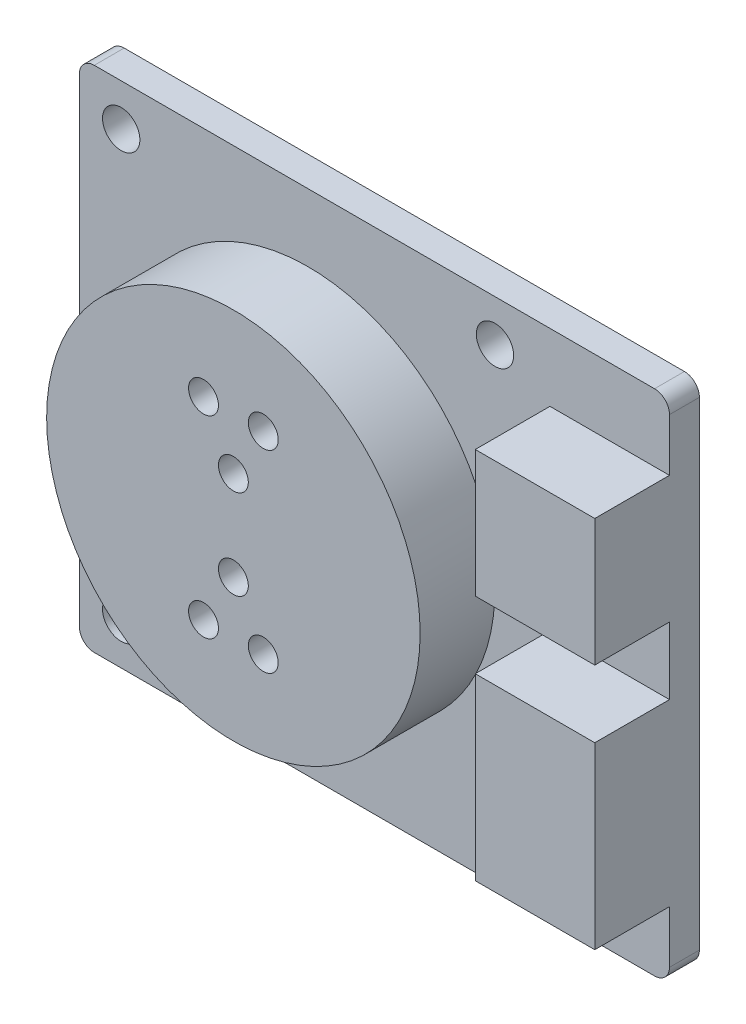
ISO-10303-21;
HEADER;
FILE_DESCRIPTION(('STEP AP214'),'2;1');
FILE_NAME('part.step','',(''),(''),'','','');
FILE_SCHEMA(('AUTOMOTIVE_DESIGN { 1 0 10303 214 1 1 1 1 }'));
ENDSEC;
DATA;
#1=APPLICATION_CONTEXT('core data for automotive mechanical design processes');
#2=APPLICATION_PROTOCOL_DEFINITION('international standard','automotive_design',2000,#1);
#3=PRODUCT_CONTEXT('',#1,'mechanical');
#4=PRODUCT('Part','Part','',(#3));
#5=PRODUCT_RELATED_PRODUCT_CATEGORY('part','',(#4));
#6=PRODUCT_DEFINITION_FORMATION('','',#4);
#7=PRODUCT_DEFINITION_CONTEXT('part definition',#1,'design');
#8=PRODUCT_DEFINITION('design','',#6,#7);
#9=PRODUCT_DEFINITION_SHAPE('','',#8);
#10=(LENGTH_UNIT() NAMED_UNIT(*) SI_UNIT(.MILLI.,.METRE.));
#11=(NAMED_UNIT(*) PLANE_ANGLE_UNIT() SI_UNIT($,.RADIAN.));
#12=(NAMED_UNIT(*) SI_UNIT($,.STERADIAN.) SOLID_ANGLE_UNIT());
#13=UNCERTAINTY_MEASURE_WITH_UNIT(LENGTH_MEASURE(1.E-05),#10,'distance_accuracy_value','');
#14=(GEOMETRIC_REPRESENTATION_CONTEXT(3) GLOBAL_UNCERTAINTY_ASSIGNED_CONTEXT((#13)) GLOBAL_UNIT_ASSIGNED_CONTEXT((#10,
#11,#12)) REPRESENTATION_CONTEXT('',''));
#15=CARTESIAN_POINT('',(0.,0.,0.));
#16=DIRECTION('',(0.,0.,1.));
#17=DIRECTION('',(1.,0.,0.));
#18=AXIS2_PLACEMENT_3D('',#15,#16,#17);
#19=CARTESIAN_POINT('',(0.,0.,2.));
#20=DIRECTION('',(0.,0.,-1.));
#21=DIRECTION('',(-1.,0.,0.));
#22=AXIS2_PLACEMENT_3D('',#19,#20,#21);
#23=PLANE('',#22);
#24=CARTESIAN_POINT('',(-4.44,0.,2.));
#25=DIRECTION('',(0.,0.,-1.));
#26=DIRECTION('',(-1.,0.,0.));
#27=AXIS2_PLACEMENT_3D('',#24,#25,#26);
#28=CIRCLE('',#27,12.5);
#29=CARTESIAN_POINT('',(-16.94,0.,2.));
#30=VERTEX_POINT('',#29);
#31=EDGE_CURVE('E302',#30,#30,#28,.F.);
#32=ORIENTED_EDGE('',*,*,#31,.F.);
#33=EDGE_LOOP('',(#32));
#34=FACE_BOUND('',#33,.T.);
#35=CARTESIAN_POINT('',(-16.95,-14.225,2.));
#36=DIRECTION('',(0.,0.,1.));
#37=DIRECTION('',(1.,0.,0.));
#38=AXIS2_PLACEMENT_3D('',#35,#36,#37);
#39=CIRCLE('',#38,1.25);
#40=CARTESIAN_POINT('',(-15.7,-14.225,2.));
#41=VERTEX_POINT('',#40);
#42=EDGE_CURVE('E265',#41,#41,#39,.T.);
#43=ORIENTED_EDGE('',*,*,#42,.F.);
#44=EDGE_LOOP('',(#43));
#45=FACE_BOUND('',#44,.T.);
#46=CARTESIAN_POINT('',(8.07,14.225,2.));
#47=DIRECTION('',(0.,0.,1.));
#48=DIRECTION('',(1.,0.,0.));
#49=AXIS2_PLACEMENT_3D('',#46,#47,#48);
#50=CIRCLE('',#49,1.25);
#51=CARTESIAN_POINT('',(9.32,14.225,2.));
#52=VERTEX_POINT('',#51);
#53=EDGE_CURVE('E274',#52,#52,#50,.T.);
#54=ORIENTED_EDGE('',*,*,#53,.F.);
#55=EDGE_LOOP('',(#54));
#56=FACE_BOUND('',#55,.T.);
#57=CARTESIAN_POINT('',(8.07,-14.225,2.));
#58=DIRECTION('',(0.,0.,1.));
#59=DIRECTION('',(1.,0.,0.));
#60=AXIS2_PLACEMENT_3D('',#57,#58,#59);
#61=CIRCLE('',#60,1.25);
#62=CARTESIAN_POINT('',(9.32,-14.225,2.));
#63=VERTEX_POINT('',#62);
#64=EDGE_CURVE('E257',#63,#63,#61,.T.);
#65=ORIENTED_EDGE('',*,*,#64,.F.);
#66=EDGE_LOOP('',(#65));
#67=FACE_BOUND('',#66,.T.);
#68=CARTESIAN_POINT('',(-16.95,14.225,2.));
#69=DIRECTION('',(0.,0.,1.));
#70=DIRECTION('',(1.,0.,0.));
#71=AXIS2_PLACEMENT_3D('',#68,#69,#70);
#72=CIRCLE('',#71,1.25);
#73=CARTESIAN_POINT('',(-15.7,14.225,2.));
#74=VERTEX_POINT('',#73);
#75=EDGE_CURVE('E269',#74,#74,#72,.T.);
#76=ORIENTED_EDGE('',*,*,#75,.F.);
#77=EDGE_LOOP('',(#76));
#78=FACE_BOUND('',#77,.T.);
#79=DIRECTION('',(-1.,0.,0.));
#80=VECTOR('',#79,1.);
#81=CARTESIAN_POINT('',(19.75,-0.500000000000004,2.));
#82=LINE('',#81,#80);
#83=CARTESIAN_POINT('',(19.75,-0.500000000000004,2.));
#84=VERTEX_POINT('',#83);
#85=CARTESIAN_POINT('',(11.75,-0.500000000000005,2.));
#86=VERTEX_POINT('',#85);
#87=EDGE_CURVE('E170',#84,#86,#82,.T.);
#88=ORIENTED_EDGE('',*,*,#87,.F.);
#89=DIRECTION('',(0.,1.,0.));
#90=VECTOR('',#89,1.);
#91=CARTESIAN_POINT('',(19.75,-17.02,2.));
#92=LINE('',#91,#90);
#93=CARTESIAN_POINT('',(19.75,4.,2.));
#94=VERTEX_POINT('',#93);
#95=EDGE_CURVE('E156',#84,#94,#92,.T.);
#96=ORIENTED_EDGE('',*,*,#95,.T.);
#97=DIRECTION('',(1.,0.,0.));
#98=VECTOR('',#97,1.);
#99=CARTESIAN_POINT('',(19.75,4.,2.));
#100=LINE('',#99,#98);
#101=CARTESIAN_POINT('',(11.75,4.,2.));
#102=VERTEX_POINT('',#101);
#103=EDGE_CURVE('E220',#102,#94,#100,.T.);
#104=ORIENTED_EDGE('',*,*,#103,.F.);
#105=DIRECTION('',(0.,-1.,0.));
#106=VECTOR('',#105,1.);
#107=CARTESIAN_POINT('',(11.75,12.5,2.));
#108=LINE('',#107,#106);
#109=CARTESIAN_POINT('',(11.75,12.5,2.));
#110=VERTEX_POINT('',#109);
#111=EDGE_CURVE('E232',#110,#102,#108,.T.);
#112=ORIENTED_EDGE('',*,*,#111,.F.);
#113=DIRECTION('',(-1.,0.,0.));
#114=VECTOR('',#113,1.);
#115=CARTESIAN_POINT('',(19.75,12.5,2.));
#116=LINE('',#115,#114);
#117=CARTESIAN_POINT('',(19.75,12.5,2.));
#118=VERTEX_POINT('',#117);
#119=EDGE_CURVE('E175',#118,#110,#116,.T.);
#120=ORIENTED_EDGE('',*,*,#119,.F.);
#121=CARTESIAN_POINT('',(19.75,16.02,2.));
#122=VERTEX_POINT('',#121);
#123=EDGE_CURVE('E168',#118,#122,#92,.T.);
#124=ORIENTED_EDGE('',*,*,#123,.T.);
#125=CARTESIAN_POINT('',(18.75,16.02,2.));
#126=DIRECTION('',(0.,0.,-1.));
#127=DIRECTION('',(-1.,0.,0.));
#128=AXIS2_PLACEMENT_3D('',#125,#126,#127);
#129=CIRCLE('',#128,1.);
#130=CARTESIAN_POINT('',(18.75,17.02,2.));
#131=VERTEX_POINT('',#130);
#132=EDGE_CURVE('E350',#122,#131,#129,.F.);
#133=ORIENTED_EDGE('',*,*,#132,.T.);
#134=DIRECTION('',(-1.,0.,0.));
#135=VECTOR('',#134,1.);
#136=CARTESIAN_POINT('',(-19.75,17.02,2.));
#137=LINE('',#136,#135);
#138=CARTESIAN_POINT('',(-18.75,17.02,2.));
#139=VERTEX_POINT('',#138);
#140=EDGE_CURVE('E290',#131,#139,#137,.T.);
#141=ORIENTED_EDGE('',*,*,#140,.T.);
#142=CARTESIAN_POINT('',(-18.75,16.02,2.));
#143=DIRECTION('',(0.,0.,-1.));
#144=DIRECTION('',(-1.,0.,0.));
#145=AXIS2_PLACEMENT_3D('',#142,#143,#144);
#146=CIRCLE('',#145,1.);
#147=CARTESIAN_POINT('',(-19.75,16.02,2.));
#148=VERTEX_POINT('',#147);
#149=EDGE_CURVE('E347',#139,#148,#146,.F.);
#150=ORIENTED_EDGE('',*,*,#149,.T.);
#151=DIRECTION('',(0.,-1.,0.));
#152=VECTOR('',#151,1.);
#153=CARTESIAN_POINT('',(-19.75,-17.02,2.));
#154=LINE('',#153,#152);
#155=CARTESIAN_POINT('',(-19.75,-16.02,2.));
#156=VERTEX_POINT('',#155);
#157=EDGE_CURVE('E294',#148,#156,#154,.T.);
#158=ORIENTED_EDGE('',*,*,#157,.T.);
#159=CARTESIAN_POINT('',(-18.75,-16.02,2.));
#160=DIRECTION('',(0.,0.,-1.));
#161=DIRECTION('',(-1.,0.,0.));
#162=AXIS2_PLACEMENT_3D('',#159,#160,#161);
#163=CIRCLE('',#162,1.);
#164=CARTESIAN_POINT('',(-18.75,-17.02,2.));
#165=VERTEX_POINT('',#164);
#166=EDGE_CURVE('E356',#156,#165,#163,.F.);
#167=ORIENTED_EDGE('',*,*,#166,.T.);
#168=DIRECTION('',(1.,0.,0.));
#169=VECTOR('',#168,1.);
#170=CARTESIAN_POINT('',(-19.75,-17.02,2.));
#171=LINE('',#170,#169);
#172=CARTESIAN_POINT('',(18.75,-17.02,2.));
#173=VERTEX_POINT('',#172);
#174=EDGE_CURVE('E298',#165,#173,#171,.T.);
#175=ORIENTED_EDGE('',*,*,#174,.T.);
#176=CARTESIAN_POINT('',(18.75,-16.02,2.));
#177=DIRECTION('',(0.,0.,-1.));
#178=DIRECTION('',(-1.,0.,0.));
#179=AXIS2_PLACEMENT_3D('',#176,#177,#178);
#180=CIRCLE('',#179,1.);
#181=CARTESIAN_POINT('',(19.75,-16.02,2.));
#182=VERTEX_POINT('',#181);
#183=EDGE_CURVE('E353',#173,#182,#180,.F.);
#184=ORIENTED_EDGE('',*,*,#183,.T.);
#185=CARTESIAN_POINT('',(19.75,-12.5,2.));
#186=VERTEX_POINT('',#185);
#187=EDGE_CURVE('E167',#182,#186,#92,.T.);
#188=ORIENTED_EDGE('',*,*,#187,.T.);
#189=DIRECTION('',(1.,0.,0.));
#190=VECTOR('',#189,1.);
#191=CARTESIAN_POINT('',(19.75,-12.5,2.));
#192=LINE('',#191,#190);
#193=CARTESIAN_POINT('',(11.75,-12.5,2.));
#194=VERTEX_POINT('',#193);
#195=EDGE_CURVE('E64',#194,#186,#192,.T.);
#196=ORIENTED_EDGE('',*,*,#195,.F.);
#197=DIRECTION('',(0.,-1.,0.));
#198=VECTOR('',#197,1.);
#199=CARTESIAN_POINT('',(11.75,-0.500000000000005,2.));
#200=LINE('',#199,#198);
#201=EDGE_CURVE('E59',#86,#194,#200,.T.);
#202=ORIENTED_EDGE('',*,*,#201,.F.);
#203=EDGE_LOOP('',(#88,#96,#104,#112,#120,#124,#133,#141,#150,#158,#167,#175,#184,#188,#196,#202));
#204=FACE_BOUND('',#203,.T.);
#205=ADVANCED_FACE('F43',(#34,#45,#56,#67,#78,#204),#23,.F.);
#206=CARTESIAN_POINT('',(19.75,-17.02,2.));
#207=DIRECTION('',(-1.,0.,0.));
#208=DIRECTION('',(0.,0.,1.));
#209=AXIS2_PLACEMENT_3D('',#206,#207,#208);
#210=PLANE('',#209);
#211=ORIENTED_EDGE('',*,*,#187,.F.);
#212=DIRECTION('',(0.,0.,-1.));
#213=VECTOR('',#212,1.);
#214=CARTESIAN_POINT('',(19.75,-16.02,2.));
#215=LINE('',#214,#213);
#216=CARTESIAN_POINT('',(19.75,-16.02,0.));
#217=VERTEX_POINT('',#216);
#218=EDGE_CURVE('E363',#182,#217,#215,.T.);
#219=ORIENTED_EDGE('',*,*,#218,.T.);
#220=DIRECTION('',(0.,1.,0.));
#221=VECTOR('',#220,1.);
#222=CARTESIAN_POINT('',(19.75,-17.02,0.));
#223=LINE('',#222,#221);
#224=CARTESIAN_POINT('',(19.75,16.02,0.));
#225=VERTEX_POINT('',#224);
#226=EDGE_CURVE('E285',#217,#225,#223,.T.);
#227=ORIENTED_EDGE('',*,*,#226,.T.);
#228=DIRECTION('',(0.,0.,-1.));
#229=VECTOR('',#228,1.);
#230=CARTESIAN_POINT('',(19.75,16.02,2.));
#231=LINE('',#230,#229);
#232=EDGE_CURVE('E359',#225,#122,#231,.F.);
#233=ORIENTED_EDGE('',*,*,#232,.T.);
#234=ORIENTED_EDGE('',*,*,#123,.F.);
#235=DIRECTION('',(0.,0.,-1.));
#236=VECTOR('',#235,1.);
#237=CARTESIAN_POINT('',(19.75,12.5,7.));
#238=LINE('',#237,#236);
#239=CARTESIAN_POINT('',(19.75,12.5,7.));
#240=VERTEX_POINT('',#239);
#241=EDGE_CURVE('E248',#240,#118,#238,.T.);
#242=ORIENTED_EDGE('',*,*,#241,.F.);
#243=DIRECTION('',(0.,1.,0.));
#244=VECTOR('',#243,1.);
#245=CARTESIAN_POINT('',(19.75,12.5,7.));
#246=LINE('',#245,#244);
#247=CARTESIAN_POINT('',(19.75,4.,7.));
#248=VERTEX_POINT('',#247);
#249=EDGE_CURVE('E215',#248,#240,#246,.T.);
#250=ORIENTED_EDGE('',*,*,#249,.F.);
#251=DIRECTION('',(0.,0.,-1.));
#252=VECTOR('',#251,1.);
#253=CARTESIAN_POINT('',(19.75,4.,7.));
#254=LINE('',#253,#252);
#255=EDGE_CURVE('E164',#248,#94,#254,.T.);
#256=ORIENTED_EDGE('',*,*,#255,.T.);
#257=ORIENTED_EDGE('',*,*,#95,.F.);
#258=DIRECTION('',(0.,0.,-1.));
#259=VECTOR('',#258,1.);
#260=CARTESIAN_POINT('',(19.75,-0.500000000000004,7.));
#261=LINE('',#260,#259);
#262=CARTESIAN_POINT('',(19.75,-0.500000000000004,7.));
#263=VERTEX_POINT('',#262);
#264=EDGE_CURVE('E161',#263,#84,#261,.T.);
#265=ORIENTED_EDGE('',*,*,#264,.F.);
#266=DIRECTION('',(0.,1.,0.));
#267=VECTOR('',#266,1.);
#268=CARTESIAN_POINT('',(19.75,-0.500000000000004,7.));
#269=LINE('',#268,#267);
#270=CARTESIAN_POINT('',(19.75,-12.5,7.));
#271=VERTEX_POINT('',#270);
#272=EDGE_CURVE('E203',#271,#263,#269,.T.);
#273=ORIENTED_EDGE('',*,*,#272,.F.);
#274=DIRECTION('',(0.,0.,-1.));
#275=VECTOR('',#274,1.);
#276=CARTESIAN_POINT('',(19.75,-12.5,7.));
#277=LINE('',#276,#275);
#278=EDGE_CURVE('E196',#271,#186,#277,.T.);
#279=ORIENTED_EDGE('',*,*,#278,.T.);
#280=EDGE_LOOP('',(#211,#219,#227,#233,#234,#242,#250,#256,#257,#265,#273,#279));
#281=FACE_BOUND('',#280,.T.);
#282=ADVANCED_FACE('F158',(#281),#210,.F.);
#283=CARTESIAN_POINT('',(-19.75,17.02,2.));
#284=DIRECTION('',(0.,-1.,0.));
#285=DIRECTION('',(0.,0.,-1.));
#286=AXIS2_PLACEMENT_3D('',#283,#284,#285);
#287=PLANE('',#286);
#288=ORIENTED_EDGE('',*,*,#140,.F.);
#289=DIRECTION('',(0.,0.,-1.));
#290=VECTOR('',#289,1.);
#291=CARTESIAN_POINT('',(18.75,17.02,2.));
#292=LINE('',#291,#290);
#293=CARTESIAN_POINT('',(18.75,17.02,0.));
#294=VERTEX_POINT('',#293);
#295=EDGE_CURVE('E11',#131,#294,#292,.T.);
#296=ORIENTED_EDGE('',*,*,#295,.T.);
#297=DIRECTION('',(-1.,0.,0.));
#298=VECTOR('',#297,1.);
#299=CARTESIAN_POINT('',(-19.75,17.02,0.));
#300=LINE('',#299,#298);
#301=CARTESIAN_POINT('',(-18.75,17.02,0.));
#302=VERTEX_POINT('',#301);
#303=EDGE_CURVE('E306',#294,#302,#300,.T.);
#304=ORIENTED_EDGE('',*,*,#303,.T.);
#305=DIRECTION('',(0.,0.,-1.));
#306=VECTOR('',#305,1.);
#307=CARTESIAN_POINT('',(-18.75,17.02,2.));
#308=LINE('',#307,#306);
#309=EDGE_CURVE('E52',#302,#139,#308,.F.);
#310=ORIENTED_EDGE('',*,*,#309,.T.);
#311=EDGE_LOOP('',(#288,#296,#304,#310));
#312=FACE_BOUND('',#311,.T.);
#313=ADVANCED_FACE('F370',(#312),#287,.F.);
#314=CARTESIAN_POINT('',(-19.75,-17.02,2.));
#315=DIRECTION('',(1.,0.,0.));
#316=DIRECTION('',(0.,0.,-1.));
#317=AXIS2_PLACEMENT_3D('',#314,#315,#316);
#318=PLANE('',#317);
#319=DIRECTION('',(0.,-1.,0.));
#320=VECTOR('',#319,1.);
#321=CARTESIAN_POINT('',(-19.75,-17.02,0.));
#322=LINE('',#321,#320);
#323=CARTESIAN_POINT('',(-19.75,16.02,0.));
#324=VERTEX_POINT('',#323);
#325=CARTESIAN_POINT('',(-19.75,-16.02,0.));
#326=VERTEX_POINT('',#325);
#327=EDGE_CURVE('E310',#324,#326,#322,.T.);
#328=ORIENTED_EDGE('',*,*,#327,.T.);
#329=DIRECTION('',(0.,0.,-1.));
#330=VECTOR('',#329,1.);
#331=CARTESIAN_POINT('',(-19.75,-16.02,2.));
#332=LINE('',#331,#330);
#333=EDGE_CURVE('E344',#326,#156,#332,.F.);
#334=ORIENTED_EDGE('',*,*,#333,.T.);
#335=ORIENTED_EDGE('',*,*,#157,.F.);
#336=DIRECTION('',(0.,0.,-1.));
#337=VECTOR('',#336,1.);
#338=CARTESIAN_POINT('',(-19.75,16.02,2.));
#339=LINE('',#338,#337);
#340=EDGE_CURVE('E340',#148,#324,#339,.T.);
#341=ORIENTED_EDGE('',*,*,#340,.T.);
#342=EDGE_LOOP('',(#328,#334,#335,#341));
#343=FACE_BOUND('',#342,.T.);
#344=ADVANCED_FACE('F380',(#343),#318,.F.);
#345=CARTESIAN_POINT('',(-19.75,-17.02,2.));
#346=DIRECTION('',(0.,1.,0.));
#347=DIRECTION('',(0.,0.,1.));
#348=AXIS2_PLACEMENT_3D('',#345,#346,#347);
#349=PLANE('',#348);
#350=ORIENTED_EDGE('',*,*,#174,.F.);
#351=DIRECTION('',(0.,0.,-1.));
#352=VECTOR('',#351,1.);
#353=CARTESIAN_POINT('',(-18.75,-17.02,2.));
#354=LINE('',#353,#352);
#355=CARTESIAN_POINT('',(-18.75,-17.02,0.));
#356=VERTEX_POINT('',#355);
#357=EDGE_CURVE('E324',#165,#356,#354,.T.);
#358=ORIENTED_EDGE('',*,*,#357,.T.);
#359=DIRECTION('',(1.,0.,0.));
#360=VECTOR('',#359,1.);
#361=CARTESIAN_POINT('',(-19.75,-17.02,0.));
#362=LINE('',#361,#360);
#363=CARTESIAN_POINT('',(18.75,-17.02,0.));
#364=VERTEX_POINT('',#363);
#365=EDGE_CURVE('E314',#356,#364,#362,.T.);
#366=ORIENTED_EDGE('',*,*,#365,.T.);
#367=DIRECTION('',(0.,0.,-1.));
#368=VECTOR('',#367,1.);
#369=CARTESIAN_POINT('',(18.75,-17.02,2.));
#370=LINE('',#369,#368);
#371=EDGE_CURVE('E321',#364,#173,#370,.F.);
#372=ORIENTED_EDGE('',*,*,#371,.T.);
#373=EDGE_LOOP('',(#350,#358,#366,#372));
#374=FACE_BOUND('',#373,.T.);
#375=ADVANCED_FACE('F391',(#374),#349,.F.);
#376=CARTESIAN_POINT('',(0.,0.,0.));
#377=DIRECTION('',(0.,0.,-1.));
#378=DIRECTION('',(-1.,0.,0.));
#379=AXIS2_PLACEMENT_3D('',#376,#377,#378);
#380=PLANE('',#379);
#381=CARTESIAN_POINT('',(-16.95,-14.225,0.));
#382=DIRECTION('',(0.,0.,1.));
#383=DIRECTION('',(1.,0.,0.));
#384=AXIS2_PLACEMENT_3D('',#381,#382,#383);
#385=CIRCLE('',#384,1.25);
#386=CARTESIAN_POINT('',(-15.7,-14.225,0.));
#387=VERTEX_POINT('',#386);
#388=EDGE_CURVE('E270',#387,#387,#385,.T.);
#389=ORIENTED_EDGE('',*,*,#388,.T.);
#390=EDGE_LOOP('',(#389));
#391=FACE_BOUND('',#390,.T.);
#392=CARTESIAN_POINT('',(8.07,14.225,0.));
#393=DIRECTION('',(0.,0.,1.));
#394=DIRECTION('',(1.,0.,0.));
#395=AXIS2_PLACEMENT_3D('',#392,#393,#394);
#396=CIRCLE('',#395,1.25);
#397=CARTESIAN_POINT('',(9.32,14.225,0.));
#398=VERTEX_POINT('',#397);
#399=EDGE_CURVE('E261',#398,#398,#396,.T.);
#400=ORIENTED_EDGE('',*,*,#399,.T.);
#401=EDGE_LOOP('',(#400));
#402=FACE_BOUND('',#401,.T.);
#403=CARTESIAN_POINT('',(8.07,-14.225,0.));
#404=DIRECTION('',(0.,0.,1.));
#405=DIRECTION('',(1.,0.,0.));
#406=AXIS2_PLACEMENT_3D('',#403,#404,#405);
#407=CIRCLE('',#406,1.25);
#408=CARTESIAN_POINT('',(9.32,-14.225,0.));
#409=VERTEX_POINT('',#408);
#410=EDGE_CURVE('E256',#409,#409,#407,.T.);
#411=ORIENTED_EDGE('',*,*,#410,.T.);
#412=EDGE_LOOP('',(#411));
#413=FACE_BOUND('',#412,.T.);
#414=CARTESIAN_POINT('',(-16.95,14.225,0.));
#415=DIRECTION('',(0.,0.,1.));
#416=DIRECTION('',(1.,0.,0.));
#417=AXIS2_PLACEMENT_3D('',#414,#415,#416);
#418=CIRCLE('',#417,1.25);
#419=CARTESIAN_POINT('',(-15.7,14.225,0.));
#420=VERTEX_POINT('',#419);
#421=EDGE_CURVE('E281',#420,#420,#418,.T.);
#422=ORIENTED_EDGE('',*,*,#421,.T.);
#423=EDGE_LOOP('',(#422));
#424=FACE_BOUND('',#423,.T.);
#425=ORIENTED_EDGE('',*,*,#365,.F.);
#426=CARTESIAN_POINT('',(-18.75,-16.02,0.));
#427=DIRECTION('',(0.,0.,-1.));
#428=DIRECTION('',(-1.,0.,0.));
#429=AXIS2_PLACEMENT_3D('',#426,#427,#428);
#430=CIRCLE('',#429,1.);
#431=EDGE_CURVE('E337',#356,#326,#430,.T.);
#432=ORIENTED_EDGE('',*,*,#431,.T.);
#433=ORIENTED_EDGE('',*,*,#327,.F.);
#434=CARTESIAN_POINT('',(-18.75,16.02,0.));
#435=DIRECTION('',(0.,0.,-1.));
#436=DIRECTION('',(-1.,0.,0.));
#437=AXIS2_PLACEMENT_3D('',#434,#435,#436);
#438=CIRCLE('',#437,1.);
#439=EDGE_CURVE('E328',#324,#302,#438,.T.);
#440=ORIENTED_EDGE('',*,*,#439,.T.);
#441=ORIENTED_EDGE('',*,*,#303,.F.);
#442=CARTESIAN_POINT('',(18.75,16.02,0.));
#443=DIRECTION('',(0.,0.,-1.));
#444=DIRECTION('',(-1.,0.,0.));
#445=AXIS2_PLACEMENT_3D('',#442,#443,#444);
#446=CIRCLE('',#445,1.);
#447=EDGE_CURVE('E331',#294,#225,#446,.T.);
#448=ORIENTED_EDGE('',*,*,#447,.T.);
#449=ORIENTED_EDGE('',*,*,#226,.F.);
#450=CARTESIAN_POINT('',(18.75,-16.02,0.));
#451=DIRECTION('',(0.,0.,-1.));
#452=DIRECTION('',(-1.,0.,0.));
#453=AXIS2_PLACEMENT_3D('',#450,#451,#452);
#454=CIRCLE('',#453,1.);
#455=EDGE_CURVE('E334',#217,#364,#454,.T.);
#456=ORIENTED_EDGE('',*,*,#455,.T.);
#457=EDGE_LOOP('',(#425,#432,#433,#440,#441,#448,#449,#456));
#458=FACE_BOUND('',#457,.T.);
#459=ADVANCED_FACE('F384',(#391,#402,#413,#424,#458),#380,.T.);
#460=CARTESIAN_POINT('',(-16.95,14.225,0.));
#461=DIRECTION('',(0.,0.,1.));
#462=DIRECTION('',(1.,0.,0.));
#463=AXIS2_PLACEMENT_3D('',#460,#461,#462);
#464=CYLINDRICAL_SURFACE('',#463,1.25);
#465=ORIENTED_EDGE('',*,*,#421,.F.);
#466=EDGE_LOOP('',(#465));
#467=FACE_BOUND('',#466,.T.);
#468=ORIENTED_EDGE('',*,*,#75,.T.);
#469=EDGE_LOOP('',(#468));
#470=FACE_BOUND('',#469,.T.);
#471=ADVANCED_FACE('F435',(#467,#470),#464,.F.);
#472=CARTESIAN_POINT('',(8.07,-14.225,0.));
#473=DIRECTION('',(0.,0.,1.));
#474=DIRECTION('',(1.,0.,0.));
#475=AXIS2_PLACEMENT_3D('',#472,#473,#474);
#476=CYLINDRICAL_SURFACE('',#475,1.25);
#477=ORIENTED_EDGE('',*,*,#410,.F.);
#478=EDGE_LOOP('',(#477));
#479=FACE_BOUND('',#478,.T.);
#480=ORIENTED_EDGE('',*,*,#64,.T.);
#481=EDGE_LOOP('',(#480));
#482=FACE_BOUND('',#481,.T.);
#483=ADVANCED_FACE('F747',(#479,#482),#476,.F.);
#484=CARTESIAN_POINT('',(8.07,14.225,0.));
#485=DIRECTION('',(0.,0.,1.));
#486=DIRECTION('',(1.,0.,0.));
#487=AXIS2_PLACEMENT_3D('',#484,#485,#486);
#488=CYLINDRICAL_SURFACE('',#487,1.25);
#489=ORIENTED_EDGE('',*,*,#399,.F.);
#490=EDGE_LOOP('',(#489));
#491=FACE_BOUND('',#490,.T.);
#492=ORIENTED_EDGE('',*,*,#53,.T.);
#493=EDGE_LOOP('',(#492));
#494=FACE_BOUND('',#493,.T.);
#495=ADVANCED_FACE('F737',(#491,#494),#488,.F.);
#496=CARTESIAN_POINT('',(-16.95,-14.225,0.));
#497=DIRECTION('',(0.,0.,1.));
#498=DIRECTION('',(1.,0.,0.));
#499=AXIS2_PLACEMENT_3D('',#496,#497,#498);
#500=CYLINDRICAL_SURFACE('',#499,1.25);
#501=ORIENTED_EDGE('',*,*,#388,.F.);
#502=EDGE_LOOP('',(#501));
#503=FACE_BOUND('',#502,.T.);
#504=ORIENTED_EDGE('',*,*,#42,.T.);
#505=EDGE_LOOP('',(#504));
#506=FACE_BOUND('',#505,.T.);
#507=ADVANCED_FACE('F727',(#503,#506),#500,.F.);
#508=CARTESIAN_POINT('',(-4.44,0.,7.));
#509=DIRECTION('',(0.,0.,-1.));
#510=DIRECTION('',(-1.,0.,0.));
#511=AXIS2_PLACEMENT_3D('',#508,#509,#510);
#512=CYLINDRICAL_SURFACE('',#511,12.5);
#513=CARTESIAN_POINT('',(-4.44,0.,7.));
#514=DIRECTION('',(0.,0.,1.));
#515=DIRECTION('',(1.,0.,0.));
#516=AXIS2_PLACEMENT_3D('',#513,#514,#515);
#517=CIRCLE('',#516,12.5);
#518=CARTESIAN_POINT('',(8.06,0.,7.));
#519=VERTEX_POINT('',#518);
#520=EDGE_CURVE('E252',#519,#519,#517,.T.);
#521=ORIENTED_EDGE('',*,*,#520,.F.);
#522=EDGE_LOOP('',(#521));
#523=FACE_BOUND('',#522,.T.);
#524=ORIENTED_EDGE('',*,*,#31,.T.);
#525=EDGE_LOOP('',(#524));
#526=FACE_BOUND('',#525,.T.);
#527=ADVANCED_FACE('F539',(#523,#526),#512,.T.);
#528=CARTESIAN_POINT('',(-4.44,0.,7.));
#529=DIRECTION('',(0.,0.,1.));
#530=DIRECTION('',(1.,0.,0.));
#531=AXIS2_PLACEMENT_3D('',#528,#529,#530);
#532=PLANE('',#531);
#533=CARTESIAN_POINT('',(-2.44,6.46410161513775,7.));
#534=DIRECTION('',(0.,0.,1.));
#535=DIRECTION('',(1.,0.,0.));
#536=AXIS2_PLACEMENT_3D('',#533,#534,#535);
#537=CIRCLE('',#536,1.);
#538=CARTESIAN_POINT('',(-1.44,6.46410161513775,7.));
#539=VERTEX_POINT('',#538);
#540=EDGE_CURVE('E850',#539,#539,#537,.T.);
#541=ORIENTED_EDGE('',*,*,#540,.F.);
#542=EDGE_LOOP('',(#541));
#543=FACE_BOUND('',#542,.T.);
#544=CARTESIAN_POINT('',(-4.44,2.99999999999999,7.));
#545=DIRECTION('',(0.,0.,1.));
#546=DIRECTION('',(1.,0.,0.));
#547=AXIS2_PLACEMENT_3D('',#544,#545,#546);
#548=CIRCLE('',#547,1.);
#549=CARTESIAN_POINT('',(-3.44,2.99999999999999,7.));
#550=VERTEX_POINT('',#549);
#551=EDGE_CURVE('E855',#550,#550,#548,.T.);
#552=ORIENTED_EDGE('',*,*,#551,.F.);
#553=EDGE_LOOP('',(#552));
#554=FACE_BOUND('',#553,.T.);
#555=CARTESIAN_POINT('',(-4.44,-2.99999999999999,7.));
#556=DIRECTION('',(0.,0.,1.));
#557=DIRECTION('',(-1.,0.,0.));
#558=AXIS2_PLACEMENT_3D('',#555,#556,#557);
#559=CIRCLE('',#558,1.);
#560=CARTESIAN_POINT('',(-5.44,-2.99999999999999,7.));
#561=VERTEX_POINT('',#560);
#562=EDGE_CURVE('E869',#561,#561,#559,.T.);
#563=ORIENTED_EDGE('',*,*,#562,.F.);
#564=EDGE_LOOP('',(#563));
#565=FACE_BOUND('',#564,.T.);
#566=CARTESIAN_POINT('',(-2.44,-6.46410161513775,7.));
#567=DIRECTION('',(0.,0.,1.));
#568=DIRECTION('',(-1.,0.,0.));
#569=AXIS2_PLACEMENT_3D('',#566,#567,#568);
#570=CIRCLE('',#569,1.);
#571=CARTESIAN_POINT('',(-3.44,-6.46410161513775,7.));
#572=VERTEX_POINT('',#571);
#573=EDGE_CURVE('E875',#572,#572,#570,.T.);
#574=ORIENTED_EDGE('',*,*,#573,.F.);
#575=EDGE_LOOP('',(#574));
#576=FACE_BOUND('',#575,.T.);
#577=CARTESIAN_POINT('',(-6.44,-6.46410161513775,7.));
#578=DIRECTION('',(0.,0.,1.));
#579=DIRECTION('',(-1.,0.,0.));
#580=AXIS2_PLACEMENT_3D('',#577,#578,#579);
#581=CIRCLE('',#580,1.);
#582=CARTESIAN_POINT('',(-7.44,-6.46410161513775,7.));
#583=VERTEX_POINT('',#582);
#584=EDGE_CURVE('E864',#583,#583,#581,.T.);
#585=ORIENTED_EDGE('',*,*,#584,.F.);
#586=EDGE_LOOP('',(#585));
#587=FACE_BOUND('',#586,.T.);
#588=CARTESIAN_POINT('',(-6.44,6.46410161513775,7.));
#589=DIRECTION('',(0.,0.,1.));
#590=DIRECTION('',(1.,0.,0.));
#591=AXIS2_PLACEMENT_3D('',#588,#589,#590);
#592=CIRCLE('',#591,1.);
#593=CARTESIAN_POINT('',(-5.44,6.46410161513775,7.));
#594=VERTEX_POINT('',#593);
#595=EDGE_CURVE('E189',#594,#594,#592,.T.);
#596=ORIENTED_EDGE('',*,*,#595,.F.);
#597=EDGE_LOOP('',(#596));
#598=FACE_BOUND('',#597,.T.);
#599=ORIENTED_EDGE('',*,*,#520,.T.);
#600=EDGE_LOOP('',(#599));
#601=FACE_BOUND('',#600,.T.);
#602=ADVANCED_FACE('F448',(#543,#554,#565,#576,#587,#598,#601),#532,.T.);
#603=CARTESIAN_POINT('',(-18.75,-16.02,2.));
#604=DIRECTION('',(0.,0.,-1.));
#605=DIRECTION('',(-1.,0.,0.));
#606=AXIS2_PLACEMENT_3D('',#603,#604,#605);
#607=CYLINDRICAL_SURFACE('',#606,1.);
#608=ORIENTED_EDGE('',*,*,#166,.F.);
#609=ORIENTED_EDGE('',*,*,#333,.F.);
#610=ORIENTED_EDGE('',*,*,#431,.F.);
#611=ORIENTED_EDGE('',*,*,#357,.F.);
#612=EDGE_LOOP('',(#608,#609,#610,#611));
#613=FACE_BOUND('',#612,.T.);
#614=ADVANCED_FACE('F388',(#613),#607,.T.);
#615=CARTESIAN_POINT('',(18.75,-16.02,2.));
#616=DIRECTION('',(0.,0.,-1.));
#617=DIRECTION('',(-1.,0.,0.));
#618=AXIS2_PLACEMENT_3D('',#615,#616,#617);
#619=CYLINDRICAL_SURFACE('',#618,1.);
#620=ORIENTED_EDGE('',*,*,#183,.F.);
#621=ORIENTED_EDGE('',*,*,#371,.F.);
#622=ORIENTED_EDGE('',*,*,#455,.F.);
#623=ORIENTED_EDGE('',*,*,#218,.F.);
#624=EDGE_LOOP('',(#620,#621,#622,#623));
#625=FACE_BOUND('',#624,.T.);
#626=ADVANCED_FACE('F396',(#625),#619,.T.);
#627=CARTESIAN_POINT('',(18.75,16.02,2.));
#628=DIRECTION('',(0.,0.,-1.));
#629=DIRECTION('',(-1.,0.,0.));
#630=AXIS2_PLACEMENT_3D('',#627,#628,#629);
#631=CYLINDRICAL_SURFACE('',#630,1.);
#632=ORIENTED_EDGE('',*,*,#132,.F.);
#633=ORIENTED_EDGE('',*,*,#232,.F.);
#634=ORIENTED_EDGE('',*,*,#447,.F.);
#635=ORIENTED_EDGE('',*,*,#295,.F.);
#636=EDGE_LOOP('',(#632,#633,#634,#635));
#637=FACE_BOUND('',#636,.T.);
#638=ADVANCED_FACE('F400',(#637),#631,.T.);
#639=CARTESIAN_POINT('',(-18.75,16.02,2.));
#640=DIRECTION('',(0.,0.,-1.));
#641=DIRECTION('',(-1.,0.,0.));
#642=AXIS2_PLACEMENT_3D('',#639,#640,#641);
#643=CYLINDRICAL_SURFACE('',#642,1.);
#644=ORIENTED_EDGE('',*,*,#149,.F.);
#645=ORIENTED_EDGE('',*,*,#309,.F.);
#646=ORIENTED_EDGE('',*,*,#439,.F.);
#647=ORIENTED_EDGE('',*,*,#340,.F.);
#648=EDGE_LOOP('',(#644,#645,#646,#647));
#649=FACE_BOUND('',#648,.T.);
#650=ADVANCED_FACE('F45',(#649),#643,.T.);
#651=CARTESIAN_POINT('',(19.75,12.5,7.));
#652=DIRECTION('',(0.,-1.,0.));
#653=DIRECTION('',(1.,0.,0.));
#654=AXIS2_PLACEMENT_3D('',#651,#652,#653);
#655=PLANE('',#654);
#656=ORIENTED_EDGE('',*,*,#119,.T.);
#657=DIRECTION('',(0.,0.,-1.));
#658=VECTOR('',#657,1.);
#659=CARTESIAN_POINT('',(11.75,12.5,7.));
#660=LINE('',#659,#658);
#661=CARTESIAN_POINT('',(11.75,12.5,7.));
#662=VERTEX_POINT('',#661);
#663=EDGE_CURVE('E244',#662,#110,#660,.T.);
#664=ORIENTED_EDGE('',*,*,#663,.F.);
#665=DIRECTION('',(-1.,0.,0.));
#666=VECTOR('',#665,1.);
#667=CARTESIAN_POINT('',(19.75,12.5,7.));
#668=LINE('',#667,#666);
#669=EDGE_CURVE('E219',#240,#662,#668,.T.);
#670=ORIENTED_EDGE('',*,*,#669,.F.);
#671=ORIENTED_EDGE('',*,*,#241,.T.);
#672=EDGE_LOOP('',(#656,#664,#670,#671));
#673=FACE_BOUND('',#672,.T.);
#674=ADVANCED_FACE('F405',(#673),#655,.F.);
#675=CARTESIAN_POINT('',(11.75,12.5,7.));
#676=DIRECTION('',(1.,0.,0.));
#677=DIRECTION('',(0.,0.,-1.));
#678=AXIS2_PLACEMENT_3D('',#675,#676,#677);
#679=PLANE('',#678);
#680=ORIENTED_EDGE('',*,*,#111,.T.);
#681=DIRECTION('',(0.,0.,-1.));
#682=VECTOR('',#681,1.);
#683=CARTESIAN_POINT('',(11.75,4.,7.));
#684=LINE('',#683,#682);
#685=CARTESIAN_POINT('',(11.75,4.,7.));
#686=VERTEX_POINT('',#685);
#687=EDGE_CURVE('E240',#686,#102,#684,.T.);
#688=ORIENTED_EDGE('',*,*,#687,.F.);
#689=DIRECTION('',(0.,-1.,0.));
#690=VECTOR('',#689,1.);
#691=CARTESIAN_POINT('',(11.75,12.5,7.));
#692=LINE('',#691,#690);
#693=EDGE_CURVE('E223',#662,#686,#692,.T.);
#694=ORIENTED_EDGE('',*,*,#693,.F.);
#695=ORIENTED_EDGE('',*,*,#663,.T.);
#696=EDGE_LOOP('',(#680,#688,#694,#695));
#697=FACE_BOUND('',#696,.T.);
#698=ADVANCED_FACE('F415',(#697),#679,.F.);
#699=CARTESIAN_POINT('',(19.75,4.,7.));
#700=DIRECTION('',(0.,1.,0.));
#701=DIRECTION('',(-1.,0.,0.));
#702=AXIS2_PLACEMENT_3D('',#699,#700,#701);
#703=PLANE('',#702);
#704=ORIENTED_EDGE('',*,*,#103,.T.);
#705=ORIENTED_EDGE('',*,*,#255,.F.);
#706=DIRECTION('',(1.,0.,0.));
#707=VECTOR('',#706,1.);
#708=CARTESIAN_POINT('',(19.75,4.,7.));
#709=LINE('',#708,#707);
#710=EDGE_CURVE('E226',#686,#248,#709,.T.);
#711=ORIENTED_EDGE('',*,*,#710,.F.);
#712=ORIENTED_EDGE('',*,*,#687,.T.);
#713=EDGE_LOOP('',(#704,#705,#711,#712));
#714=FACE_BOUND('',#713,.T.);
#715=ADVANCED_FACE('F413',(#714),#703,.F.);
#716=CARTESIAN_POINT('',(0.,0.,7.));
#717=DIRECTION('',(0.,0.,-1.));
#718=DIRECTION('',(-1.,0.,0.));
#719=AXIS2_PLACEMENT_3D('',#716,#717,#718);
#720=PLANE('',#719);
#721=ORIENTED_EDGE('',*,*,#249,.T.);
#722=ORIENTED_EDGE('',*,*,#669,.T.);
#723=ORIENTED_EDGE('',*,*,#693,.T.);
#724=ORIENTED_EDGE('',*,*,#710,.T.);
#725=EDGE_LOOP('',(#721,#722,#723,#724));
#726=FACE_BOUND('',#725,.T.);
#727=ADVANCED_FACE('F409',(#726),#720,.F.);
#728=CARTESIAN_POINT('',(19.75,-0.500000000000004,7.));
#729=DIRECTION('',(0.,-1.,0.));
#730=DIRECTION('',(1.,0.,0.));
#731=AXIS2_PLACEMENT_3D('',#728,#729,#730);
#732=PLANE('',#731);
#733=ORIENTED_EDGE('',*,*,#87,.T.);
#734=DIRECTION('',(0.,0.,-1.));
#735=VECTOR('',#734,1.);
#736=CARTESIAN_POINT('',(11.75,-0.500000000000005,7.));
#737=LINE('',#736,#735);
#738=CARTESIAN_POINT('',(11.75,-0.500000000000005,7.));
#739=VERTEX_POINT('',#738);
#740=EDGE_CURVE('E181',#739,#86,#737,.T.);
#741=ORIENTED_EDGE('',*,*,#740,.F.);
#742=DIRECTION('',(-1.,0.,0.));
#743=VECTOR('',#742,1.);
#744=CARTESIAN_POINT('',(19.75,-0.500000000000004,7.));
#745=LINE('',#744,#743);
#746=EDGE_CURVE('E178',#263,#739,#745,.T.);
#747=ORIENTED_EDGE('',*,*,#746,.F.);
#748=ORIENTED_EDGE('',*,*,#264,.T.);
#749=EDGE_LOOP('',(#733,#741,#747,#748));
#750=FACE_BOUND('',#749,.T.);
#751=ADVANCED_FACE('F177',(#750),#732,.F.);
#752=CARTESIAN_POINT('',(11.75,-0.500000000000005,7.));
#753=DIRECTION('',(1.,0.,0.));
#754=DIRECTION('',(0.,1.,0.));
#755=AXIS2_PLACEMENT_3D('',#752,#753,#754);
#756=PLANE('',#755);
#757=ORIENTED_EDGE('',*,*,#201,.T.);
#758=DIRECTION('',(0.,0.,-1.));
#759=VECTOR('',#758,1.);
#760=CARTESIAN_POINT('',(11.75,-12.5,7.));
#761=LINE('',#760,#759);
#762=CARTESIAN_POINT('',(11.75,-12.5,7.));
#763=VERTEX_POINT('',#762);
#764=EDGE_CURVE('E186',#763,#194,#761,.T.);
#765=ORIENTED_EDGE('',*,*,#764,.F.);
#766=DIRECTION('',(0.,-1.,0.));
#767=VECTOR('',#766,1.);
#768=CARTESIAN_POINT('',(11.75,-0.500000000000005,7.));
#769=LINE('',#768,#767);
#770=EDGE_CURVE('E208',#739,#763,#769,.T.);
#771=ORIENTED_EDGE('',*,*,#770,.F.);
#772=ORIENTED_EDGE('',*,*,#740,.T.);
#773=EDGE_LOOP('',(#757,#765,#771,#772));
#774=FACE_BOUND('',#773,.T.);
#775=ADVANCED_FACE('F494',(#774),#756,.F.);
#776=CARTESIAN_POINT('',(19.75,-12.5,7.));
#777=DIRECTION('',(0.,1.,0.));
#778=DIRECTION('',(-1.,0.,0.));
#779=AXIS2_PLACEMENT_3D('',#776,#777,#778);
#780=PLANE('',#779);
#781=ORIENTED_EDGE('',*,*,#195,.T.);
#782=ORIENTED_EDGE('',*,*,#278,.F.);
#783=DIRECTION('',(1.,0.,0.));
#784=VECTOR('',#783,1.);
#785=CARTESIAN_POINT('',(19.75,-12.5,7.));
#786=LINE('',#785,#784);
#787=EDGE_CURVE('E200',#763,#271,#786,.T.);
#788=ORIENTED_EDGE('',*,*,#787,.F.);
#789=ORIENTED_EDGE('',*,*,#764,.T.);
#790=EDGE_LOOP('',(#781,#782,#788,#789));
#791=FACE_BOUND('',#790,.T.);
#792=ADVANCED_FACE('F504',(#791),#780,.F.);
#793=CARTESIAN_POINT('',(0.,0.,7.));
#794=DIRECTION('',(0.,0.,-1.));
#795=DIRECTION('',(-1.,0.,0.));
#796=AXIS2_PLACEMENT_3D('',#793,#794,#795);
#797=PLANE('',#796);
#798=ORIENTED_EDGE('',*,*,#272,.T.);
#799=ORIENTED_EDGE('',*,*,#746,.T.);
#800=ORIENTED_EDGE('',*,*,#770,.T.);
#801=ORIENTED_EDGE('',*,*,#787,.T.);
#802=EDGE_LOOP('',(#798,#799,#800,#801));
#803=FACE_BOUND('',#802,.T.);
#804=ADVANCED_FACE('F515',(#803),#797,.F.);
#805=CARTESIAN_POINT('',(0.,0.,2.));
#806=DIRECTION('',(0.,0.,-1.));
#807=DIRECTION('',(-1.,0.,0.));
#808=AXIS2_PLACEMENT_3D('',#805,#806,#807);
#809=PLANE('',#808);
#810=CARTESIAN_POINT('',(-6.44,6.46410161513775,2.));
#811=DIRECTION('',(0.,0.,-1.));
#812=DIRECTION('',(-1.,0.,0.));
#813=AXIS2_PLACEMENT_3D('',#810,#811,#812);
#814=CIRCLE('',#813,1.);
#815=CARTESIAN_POINT('',(-7.44,6.46410161513775,2.));
#816=VERTEX_POINT('',#815);
#817=EDGE_CURVE('E182',#816,#816,#814,.F.);
#818=ORIENTED_EDGE('',*,*,#817,.T.);
#819=EDGE_LOOP('',(#818));
#820=FACE_BOUND('',#819,.T.);
#821=ADVANCED_FACE('F526',(#820),#809,.F.);
#822=CARTESIAN_POINT('',(-6.44,6.46410161513775,-0.82842712474619));
#823=DIRECTION('',(0.,0.,1.));
#824=DIRECTION('',(1.,0.,0.));
#825=AXIS2_PLACEMENT_3D('',#822,#823,#824);
#826=CYLINDRICAL_SURFACE('',#825,1.);
#827=ORIENTED_EDGE('',*,*,#595,.T.);
#828=EDGE_LOOP('',(#827));
#829=FACE_BOUND('',#828,.T.);
#830=ORIENTED_EDGE('',*,*,#817,.F.);
#831=EDGE_LOOP('',(#830));
#832=FACE_BOUND('',#831,.T.);
#833=ADVANCED_FACE('F551',(#829,#832),#826,.F.);
#834=CARTESIAN_POINT('',(0.,0.,2.));
#835=DIRECTION('',(0.,0.,-1.));
#836=DIRECTION('',(-1.,0.,0.));
#837=AXIS2_PLACEMENT_3D('',#834,#835,#836);
#838=PLANE('',#837);
#839=CARTESIAN_POINT('',(-6.44,-6.46410161513775,2.));
#840=DIRECTION('',(0.,0.,-1.));
#841=DIRECTION('',(-1.,0.,0.));
#842=AXIS2_PLACEMENT_3D('',#839,#840,#841);
#843=CIRCLE('',#842,1.);
#844=CARTESIAN_POINT('',(-7.44,-6.46410161513775,2.));
#845=VERTEX_POINT('',#844);
#846=EDGE_CURVE('E898',#845,#845,#843,.F.);
#847=ORIENTED_EDGE('',*,*,#846,.T.);
#848=EDGE_LOOP('',(#847));
#849=FACE_BOUND('',#848,.T.);
#850=ADVANCED_FACE('F562',(#849),#838,.F.);
#851=CARTESIAN_POINT('',(-6.44,-6.46410161513775,-0.82842712474619));
#852=DIRECTION('',(0.,0.,1.));
#853=DIRECTION('',(1.,0.,0.));
#854=AXIS2_PLACEMENT_3D('',#851,#852,#853);
#855=CYLINDRICAL_SURFACE('',#854,1.);
#856=ORIENTED_EDGE('',*,*,#584,.T.);
#857=EDGE_LOOP('',(#856));
#858=FACE_BOUND('',#857,.T.);
#859=ORIENTED_EDGE('',*,*,#846,.F.);
#860=EDGE_LOOP('',(#859));
#861=FACE_BOUND('',#860,.T.);
#862=ADVANCED_FACE('F573',(#858,#861),#855,.F.);
#863=CARTESIAN_POINT('',(0.,0.,2.));
#864=DIRECTION('',(0.,0.,-1.));
#865=DIRECTION('',(-1.,0.,0.));
#866=AXIS2_PLACEMENT_3D('',#863,#864,#865);
#867=PLANE('',#866);
#868=CARTESIAN_POINT('',(-2.44,-6.46410161513775,2.));
#869=DIRECTION('',(0.,0.,-1.));
#870=DIRECTION('',(-1.,0.,0.));
#871=AXIS2_PLACEMENT_3D('',#868,#869,#870);
#872=CIRCLE('',#871,1.);
#873=CARTESIAN_POINT('',(-3.44,-6.46410161513775,2.));
#874=VERTEX_POINT('',#873);
#875=EDGE_CURVE('E879',#874,#874,#872,.F.);
#876=ORIENTED_EDGE('',*,*,#875,.T.);
#877=EDGE_LOOP('',(#876));
#878=FACE_BOUND('',#877,.T.);
#879=ADVANCED_FACE('F584',(#878),#867,.F.);
#880=CARTESIAN_POINT('',(-2.44,-6.46410161513775,-0.82842712474619));
#881=DIRECTION('',(0.,0.,1.));
#882=DIRECTION('',(1.,0.,0.));
#883=AXIS2_PLACEMENT_3D('',#880,#881,#882);
#884=CYLINDRICAL_SURFACE('',#883,1.);
#885=ORIENTED_EDGE('',*,*,#573,.T.);
#886=EDGE_LOOP('',(#885));
#887=FACE_BOUND('',#886,.T.);
#888=ORIENTED_EDGE('',*,*,#875,.F.);
#889=EDGE_LOOP('',(#888));
#890=FACE_BOUND('',#889,.T.);
#891=ADVANCED_FACE('F595',(#887,#890),#884,.F.);
#892=CARTESIAN_POINT('',(0.,0.,2.));
#893=DIRECTION('',(0.,0.,-1.));
#894=DIRECTION('',(-1.,0.,0.));
#895=AXIS2_PLACEMENT_3D('',#892,#893,#894);
#896=PLANE('',#895);
#897=CARTESIAN_POINT('',(-4.44,-2.99999999999999,2.));
#898=DIRECTION('',(0.,0.,-1.));
#899=DIRECTION('',(-1.,0.,0.));
#900=AXIS2_PLACEMENT_3D('',#897,#898,#899);
#901=CIRCLE('',#900,1.);
#902=CARTESIAN_POINT('',(-5.44,-2.99999999999999,2.));
#903=VERTEX_POINT('',#902);
#904=EDGE_CURVE('E871',#903,#903,#901,.F.);
#905=ORIENTED_EDGE('',*,*,#904,.T.);
#906=EDGE_LOOP('',(#905));
#907=FACE_BOUND('',#906,.T.);
#908=ADVANCED_FACE('F606',(#907),#896,.F.);
#909=CARTESIAN_POINT('',(-4.44,-2.99999999999999,-0.82842712474619));
#910=DIRECTION('',(0.,0.,1.));
#911=DIRECTION('',(1.,0.,0.));
#912=AXIS2_PLACEMENT_3D('',#909,#910,#911);
#913=CYLINDRICAL_SURFACE('',#912,1.);
#914=ORIENTED_EDGE('',*,*,#562,.T.);
#915=EDGE_LOOP('',(#914));
#916=FACE_BOUND('',#915,.T.);
#917=ORIENTED_EDGE('',*,*,#904,.F.);
#918=EDGE_LOOP('',(#917));
#919=FACE_BOUND('',#918,.T.);
#920=ADVANCED_FACE('F617',(#916,#919),#913,.F.);
#921=CARTESIAN_POINT('',(0.,0.,2.));
#922=DIRECTION('',(0.,0.,-1.));
#923=DIRECTION('',(-1.,0.,0.));
#924=AXIS2_PLACEMENT_3D('',#921,#922,#923);
#925=PLANE('',#924);
#926=CARTESIAN_POINT('',(-4.44,2.99999999999999,2.));
#927=DIRECTION('',(0.,0.,-1.));
#928=DIRECTION('',(-1.,0.,0.));
#929=AXIS2_PLACEMENT_3D('',#926,#927,#928);
#930=CIRCLE('',#929,1.);
#931=CARTESIAN_POINT('',(-5.44,2.99999999999999,2.));
#932=VERTEX_POINT('',#931);
#933=EDGE_CURVE('E861',#932,#932,#930,.F.);
#934=ORIENTED_EDGE('',*,*,#933,.T.);
#935=EDGE_LOOP('',(#934));
#936=FACE_BOUND('',#935,.T.);
#937=ADVANCED_FACE('F628',(#936),#925,.F.);
#938=CARTESIAN_POINT('',(-4.44,2.99999999999999,-0.82842712474619));
#939=DIRECTION('',(0.,0.,1.));
#940=DIRECTION('',(1.,0.,0.));
#941=AXIS2_PLACEMENT_3D('',#938,#939,#940);
#942=CYLINDRICAL_SURFACE('',#941,1.);
#943=ORIENTED_EDGE('',*,*,#551,.T.);
#944=EDGE_LOOP('',(#943));
#945=FACE_BOUND('',#944,.T.);
#946=ORIENTED_EDGE('',*,*,#933,.F.);
#947=EDGE_LOOP('',(#946));
#948=FACE_BOUND('',#947,.T.);
#949=ADVANCED_FACE('F639',(#945,#948),#942,.F.);
#950=CARTESIAN_POINT('',(0.,0.,2.));
#951=DIRECTION('',(0.,0.,-1.));
#952=DIRECTION('',(-1.,0.,0.));
#953=AXIS2_PLACEMENT_3D('',#950,#951,#952);
#954=PLANE('',#953);
#955=CARTESIAN_POINT('',(-2.44,6.46410161513775,2.));
#956=DIRECTION('',(0.,0.,-1.));
#957=DIRECTION('',(-1.,0.,0.));
#958=AXIS2_PLACEMENT_3D('',#955,#956,#957);
#959=CIRCLE('',#958,1.);
#960=CARTESIAN_POINT('',(-3.44,6.46410161513775,2.));
#961=VERTEX_POINT('',#960);
#962=EDGE_CURVE('E853',#961,#961,#959,.F.);
#963=ORIENTED_EDGE('',*,*,#962,.T.);
#964=EDGE_LOOP('',(#963));
#965=FACE_BOUND('',#964,.T.);
#966=ADVANCED_FACE('F650',(#965),#954,.F.);
#967=CARTESIAN_POINT('',(-2.44,6.46410161513775,-0.82842712474619));
#968=DIRECTION('',(0.,0.,1.));
#969=DIRECTION('',(1.,0.,0.));
#970=AXIS2_PLACEMENT_3D('',#967,#968,#969);
#971=CYLINDRICAL_SURFACE('',#970,1.);
#972=ORIENTED_EDGE('',*,*,#540,.T.);
#973=EDGE_LOOP('',(#972));
#974=FACE_BOUND('',#973,.T.);
#975=ORIENTED_EDGE('',*,*,#962,.F.);
#976=EDGE_LOOP('',(#975));
#977=FACE_BOUND('',#976,.T.);
#978=ADVANCED_FACE('F661',(#974,#977),#971,.F.);
#979=CLOSED_SHELL('',(#205,#282,#313,#344,#375,#459,#471,#483,#495,#507,#527,#602,#614,#626,
#638,#650,#674,#698,#715,#727,#751,#775,#792,#804,#821,#833,#850,#862,#879,#891,#908,#920,#937,
#949,#966,#978));
#980=MANIFOLD_SOLID_BREP('B2',#979);
#981=ADVANCED_BREP_SHAPE_REPRESENTATION('',(#18,#980),#14);
#982=SHAPE_DEFINITION_REPRESENTATION(#9,#981);
ENDSEC;
END-ISO-10303-21;
